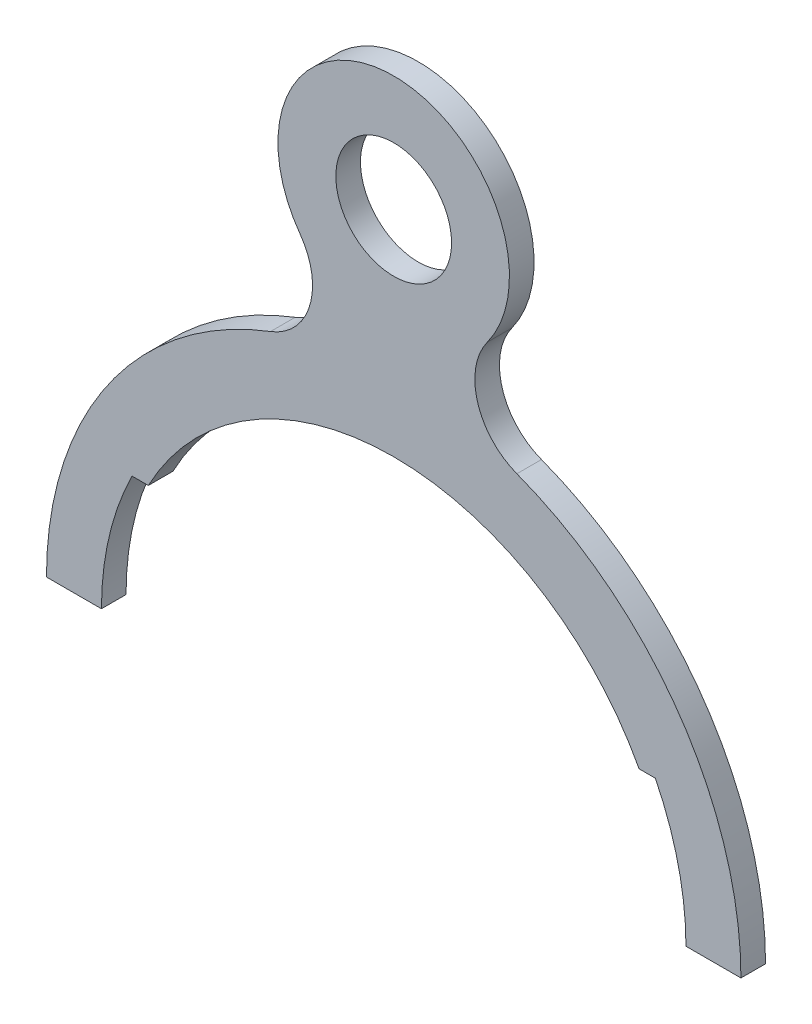
ISO-10303-21;
HEADER;
FILE_DESCRIPTION(('STEP AP214'),'2;1');
FILE_NAME('part.step','',(''),(''),'','','');
FILE_SCHEMA(('AUTOMOTIVE_DESIGN { 1 0 10303 214 1 1 1 1 }'));
ENDSEC;
DATA;
#1=APPLICATION_CONTEXT('core data for automotive mechanical design processes');
#2=APPLICATION_PROTOCOL_DEFINITION('international standard','automotive_design',2000,#1);
#3=PRODUCT_CONTEXT('',#1,'mechanical');
#4=PRODUCT('Part','Part','',(#3));
#5=PRODUCT_RELATED_PRODUCT_CATEGORY('part','',(#4));
#6=PRODUCT_DEFINITION_FORMATION('','',#4);
#7=PRODUCT_DEFINITION_CONTEXT('part definition',#1,'design');
#8=PRODUCT_DEFINITION('design','',#6,#7);
#9=PRODUCT_DEFINITION_SHAPE('','',#8);
#10=(LENGTH_UNIT() NAMED_UNIT(*) SI_UNIT(.MILLI.,.METRE.));
#11=(NAMED_UNIT(*) PLANE_ANGLE_UNIT() SI_UNIT($,.RADIAN.));
#12=(NAMED_UNIT(*) SI_UNIT($,.STERADIAN.) SOLID_ANGLE_UNIT());
#13=UNCERTAINTY_MEASURE_WITH_UNIT(LENGTH_MEASURE(1.E-05),#10,'distance_accuracy_value','');
#14=(GEOMETRIC_REPRESENTATION_CONTEXT(3) GLOBAL_UNCERTAINTY_ASSIGNED_CONTEXT((#13)) GLOBAL_UNIT_ASSIGNED_CONTEXT((#10,
#11,#12)) REPRESENTATION_CONTEXT('',''));
#15=CARTESIAN_POINT('',(0.,0.,0.));
#16=DIRECTION('',(0.,0.,1.));
#17=DIRECTION('',(1.,0.,0.));
#18=AXIS2_PLACEMENT_3D('',#15,#16,#17);
#19=CARTESIAN_POINT('',(140.,169.705627484771,8.5));
#20=DIRECTION('',(0.,0.,-1.));
#21=DIRECTION('',(-1.,0.,0.));
#22=AXIS2_PLACEMENT_3D('',#19,#20,#21);
#23=PLANE('',#22);
#24=CARTESIAN_POINT('',(0.,170.,8.5));
#25=DIRECTION('',(0.,0.,1.));
#26=DIRECTION('',(1.,0.,0.));
#27=AXIS2_PLACEMENT_3D('',#24,#25,#26);
#28=CIRCLE('',#27,20.);
#29=CARTESIAN_POINT('',(20.,170.,8.5));
#30=VERTEX_POINT('',#29);
#31=EDGE_CURVE('E143',#30,#30,#28,.T.);
#32=ORIENTED_EDGE('',*,*,#31,.F.);
#33=EDGE_LOOP('',(#32));
#34=FACE_BOUND('',#33,.T.);
#35=CARTESIAN_POINT('',(50.5431142826012,133.235294117647,8.5));
#36=DIRECTION('',(0.,0.,-1.));
#37=DIRECTION('',(-1.,0.,0.));
#38=AXIS2_PLACEMENT_3D('',#35,#36,#37);
#39=CIRCLE('',#38,22.5);
#40=CARTESIAN_POINT('',(42.5626225537694,112.198142414861,8.5));
#41=VERTEX_POINT('',#40);
#42=CARTESIAN_POINT('',(32.3475931408648,146.470588235294,8.5));
#43=VERTEX_POINT('',#42);
#44=EDGE_CURVE('E254',#41,#43,#39,.T.);
#45=ORIENTED_EDGE('',*,*,#44,.T.);
#46=CARTESIAN_POINT('',(0.,170.,8.5));
#47=DIRECTION('',(0.,0.,1.));
#48=DIRECTION('',(1.,0.,0.));
#49=AXIS2_PLACEMENT_3D('',#46,#47,#48);
#50=CIRCLE('',#49,40.);
#51=CARTESIAN_POINT('',(-32.3475931408648,146.470588235294,8.5));
#52=VERTEX_POINT('',#51);
#53=EDGE_CURVE('E159',#43,#52,#50,.T.);
#54=ORIENTED_EDGE('',*,*,#53,.T.);
#55=CARTESIAN_POINT('',(-50.5431142826012,133.235294117647,8.5));
#56=DIRECTION('',(0.,0.,1.));
#57=DIRECTION('',(1.,0.,0.));
#58=AXIS2_PLACEMENT_3D('',#55,#56,#57);
#59=CIRCLE('',#58,22.5);
#60=CARTESIAN_POINT('',(-42.5626225537694,112.198142414861,8.5));
#61=VERTEX_POINT('',#60);
#62=EDGE_CURVE('E199',#61,#52,#59,.T.);
#63=ORIENTED_EDGE('',*,*,#62,.F.);
#64=CARTESIAN_POINT('',(0.,0.,8.5));
#65=DIRECTION('',(0.,0.,1.));
#66=DIRECTION('',(1.,0.,0.));
#67=AXIS2_PLACEMENT_3D('',#64,#65,#66);
#68=CIRCLE('',#67,120.);
#69=CARTESIAN_POINT('',(-120.,0.,8.5));
#70=VERTEX_POINT('',#69);
#71=EDGE_CURVE('E97',#61,#70,#68,.T.);
#72=ORIENTED_EDGE('',*,*,#71,.T.);
#73=DIRECTION('',(1.,0.,0.));
#74=VECTOR('',#73,1.);
#75=CARTESIAN_POINT('',(-120.,0.,8.5));
#76=LINE('',#75,#74);
#77=CARTESIAN_POINT('',(-101.,0.,8.5));
#78=VERTEX_POINT('',#77);
#79=EDGE_CURVE('E220',#70,#78,#76,.T.);
#80=ORIENTED_EDGE('',*,*,#79,.T.);
#81=CARTESIAN_POINT('',(0.,0.,8.5));
#82=DIRECTION('',(0.,0.,-1.));
#83=DIRECTION('',(1.,0.,0.));
#84=AXIS2_PLACEMENT_3D('',#81,#82,#83);
#85=CIRCLE('',#84,101.);
#86=CARTESIAN_POINT('',(-90.4212364436585,45.,8.5));
#87=VERTEX_POINT('',#86);
#88=EDGE_CURVE('E222',#78,#87,#85,.T.);
#89=ORIENTED_EDGE('',*,*,#88,.T.);
#90=DIRECTION('',(1.,0.,0.));
#91=VECTOR('',#90,1.);
#92=CARTESIAN_POINT('',(-90.4212364436585,45.,8.5));
#93=LINE('',#92,#91);
#94=CARTESIAN_POINT('',(-84.7997641506154,45.,8.5));
#95=VERTEX_POINT('',#94);
#96=EDGE_CURVE('E224',#87,#95,#93,.T.);
#97=ORIENTED_EDGE('',*,*,#96,.T.);
#98=CARTESIAN_POINT('',(0.,0.,8.5));
#99=DIRECTION('',(0.,0.,-1.));
#100=DIRECTION('',(1.,0.,0.));
#101=AXIS2_PLACEMENT_3D('',#98,#99,#100);
#102=CIRCLE('',#101,96.);
#103=CARTESIAN_POINT('',(84.7997641506154,45.,8.5));
#104=VERTEX_POINT('',#103);
#105=EDGE_CURVE('E119',#95,#104,#102,.T.);
#106=ORIENTED_EDGE('',*,*,#105,.T.);
#107=DIRECTION('',(1.,0.,0.));
#108=VECTOR('',#107,1.);
#109=CARTESIAN_POINT('',(84.7997641506154,45.,8.5));
#110=LINE('',#109,#108);
#111=CARTESIAN_POINT('',(90.4212364436585,45.,8.5));
#112=VERTEX_POINT('',#111);
#113=EDGE_CURVE('E113',#104,#112,#110,.T.);
#114=ORIENTED_EDGE('',*,*,#113,.T.);
#115=CARTESIAN_POINT('',(0.,0.,8.5));
#116=DIRECTION('',(0.,0.,-1.));
#117=DIRECTION('',(1.,0.,0.));
#118=AXIS2_PLACEMENT_3D('',#115,#116,#117);
#119=CIRCLE('',#118,101.);
#120=CARTESIAN_POINT('',(101.,0.,8.5));
#121=VERTEX_POINT('',#120);
#122=EDGE_CURVE('E117',#112,#121,#119,.T.);
#123=ORIENTED_EDGE('',*,*,#122,.T.);
#124=DIRECTION('',(1.,0.,0.));
#125=VECTOR('',#124,1.);
#126=CARTESIAN_POINT('',(101.,0.,8.5));
#127=LINE('',#126,#125);
#128=CARTESIAN_POINT('',(120.,0.,8.5));
#129=VERTEX_POINT('',#128);
#130=EDGE_CURVE('E53',#121,#129,#127,.T.);
#131=ORIENTED_EDGE('',*,*,#130,.T.);
#132=CARTESIAN_POINT('',(0.,0.,8.5));
#133=DIRECTION('',(0.,0.,1.));
#134=DIRECTION('',(1.,0.,0.));
#135=AXIS2_PLACEMENT_3D('',#132,#133,#134);
#136=CIRCLE('',#135,120.);
#137=EDGE_CURVE('E133',#129,#41,#136,.T.);
#138=ORIENTED_EDGE('',*,*,#137,.T.);
#139=EDGE_LOOP('',(#45,#54,#63,#72,#80,#89,#97,#106,#114,#123,#131,#138));
#140=FACE_BOUND('',#139,.T.);
#141=ADVANCED_FACE('F36',(#34,#140),#23,.F.);
#142=CARTESIAN_POINT('',(140.,169.705627484771,0.));
#143=DIRECTION('',(0.,0.,-1.));
#144=DIRECTION('',(-1.,0.,0.));
#145=AXIS2_PLACEMENT_3D('',#142,#143,#144);
#146=PLANE('',#145);
#147=CARTESIAN_POINT('',(0.,170.,0.));
#148=DIRECTION('',(0.,0.,1.));
#149=DIRECTION('',(1.,0.,0.));
#150=AXIS2_PLACEMENT_3D('',#147,#148,#149);
#151=CIRCLE('',#150,20.);
#152=CARTESIAN_POINT('',(20.,170.,0.));
#153=VERTEX_POINT('',#152);
#154=EDGE_CURVE('E212',#153,#153,#151,.T.);
#155=ORIENTED_EDGE('',*,*,#154,.T.);
#156=EDGE_LOOP('',(#155));
#157=FACE_BOUND('',#156,.T.);
#158=CARTESIAN_POINT('',(0.,170.,0.));
#159=DIRECTION('',(0.,0.,1.));
#160=DIRECTION('',(1.,0.,0.));
#161=AXIS2_PLACEMENT_3D('',#158,#159,#160);
#162=CIRCLE('',#161,40.);
#163=CARTESIAN_POINT('',(32.3475931408648,146.470588235294,0.));
#164=VERTEX_POINT('',#163);
#165=CARTESIAN_POINT('',(-32.3475931408648,146.470588235294,0.));
#166=VERTEX_POINT('',#165);
#167=EDGE_CURVE('E139',#164,#166,#162,.T.);
#168=ORIENTED_EDGE('',*,*,#167,.F.);
#169=CARTESIAN_POINT('',(50.5431142826012,133.235294117647,0.));
#170=DIRECTION('',(0.,0.,-1.));
#171=DIRECTION('',(-1.,0.,0.));
#172=AXIS2_PLACEMENT_3D('',#169,#170,#171);
#173=CIRCLE('',#172,22.5);
#174=CARTESIAN_POINT('',(42.5626225537694,112.198142414861,0.));
#175=VERTEX_POINT('',#174);
#176=EDGE_CURVE('E11',#164,#175,#173,.F.);
#177=ORIENTED_EDGE('',*,*,#176,.T.);
#178=CARTESIAN_POINT('',(0.,0.,0.));
#179=DIRECTION('',(0.,0.,1.));
#180=DIRECTION('',(1.,0.,0.));
#181=AXIS2_PLACEMENT_3D('',#178,#179,#180);
#182=CIRCLE('',#181,120.);
#183=CARTESIAN_POINT('',(120.,0.,0.));
#184=VERTEX_POINT('',#183);
#185=EDGE_CURVE('E156',#184,#175,#182,.T.);
#186=ORIENTED_EDGE('',*,*,#185,.F.);
#187=DIRECTION('',(1.,0.,0.));
#188=VECTOR('',#187,1.);
#189=CARTESIAN_POINT('',(101.,0.,0.));
#190=LINE('',#189,#188);
#191=CARTESIAN_POINT('',(101.,0.,0.));
#192=VERTEX_POINT('',#191);
#193=EDGE_CURVE('E89',#192,#184,#190,.T.);
#194=ORIENTED_EDGE('',*,*,#193,.F.);
#195=CARTESIAN_POINT('',(0.,0.,0.));
#196=DIRECTION('',(0.,0.,-1.));
#197=DIRECTION('',(1.,0.,0.));
#198=AXIS2_PLACEMENT_3D('',#195,#196,#197);
#199=CIRCLE('',#198,101.);
#200=CARTESIAN_POINT('',(90.4212364436585,45.,0.));
#201=VERTEX_POINT('',#200);
#202=EDGE_CURVE('E83',#201,#192,#199,.T.);
#203=ORIENTED_EDGE('',*,*,#202,.F.);
#204=DIRECTION('',(1.,0.,0.));
#205=VECTOR('',#204,1.);
#206=CARTESIAN_POINT('',(84.7997641506154,45.,0.));
#207=LINE('',#206,#205);
#208=CARTESIAN_POINT('',(84.7997641506154,45.,0.));
#209=VERTEX_POINT('',#208);
#210=EDGE_CURVE('E127',#209,#201,#207,.T.);
#211=ORIENTED_EDGE('',*,*,#210,.F.);
#212=CARTESIAN_POINT('',(0.,0.,0.));
#213=DIRECTION('',(0.,0.,-1.));
#214=DIRECTION('',(1.,0.,0.));
#215=AXIS2_PLACEMENT_3D('',#212,#213,#214);
#216=CIRCLE('',#215,96.);
#217=CARTESIAN_POINT('',(-84.7997641506154,45.,0.));
#218=VERTEX_POINT('',#217);
#219=EDGE_CURVE('E151',#218,#209,#216,.T.);
#220=ORIENTED_EDGE('',*,*,#219,.F.);
#221=DIRECTION('',(1.,0.,0.));
#222=VECTOR('',#221,1.);
#223=CARTESIAN_POINT('',(-90.4212364436585,45.,0.));
#224=LINE('',#223,#222);
#225=CARTESIAN_POINT('',(-90.4212364436585,45.,0.));
#226=VERTEX_POINT('',#225);
#227=EDGE_CURVE('E149',#226,#218,#224,.T.);
#228=ORIENTED_EDGE('',*,*,#227,.F.);
#229=CARTESIAN_POINT('',(0.,0.,0.));
#230=DIRECTION('',(0.,0.,-1.));
#231=DIRECTION('',(1.,0.,0.));
#232=AXIS2_PLACEMENT_3D('',#229,#230,#231);
#233=CIRCLE('',#232,101.);
#234=CARTESIAN_POINT('',(-101.,0.,0.));
#235=VERTEX_POINT('',#234);
#236=EDGE_CURVE('E147',#235,#226,#233,.T.);
#237=ORIENTED_EDGE('',*,*,#236,.F.);
#238=DIRECTION('',(1.,0.,0.));
#239=VECTOR('',#238,1.);
#240=CARTESIAN_POINT('',(-120.,0.,0.));
#241=LINE('',#240,#239);
#242=CARTESIAN_POINT('',(-120.,0.,0.));
#243=VERTEX_POINT('',#242);
#244=EDGE_CURVE('E145',#243,#235,#241,.T.);
#245=ORIENTED_EDGE('',*,*,#244,.F.);
#246=CARTESIAN_POINT('',(0.,0.,0.));
#247=DIRECTION('',(0.,0.,1.));
#248=DIRECTION('',(1.,0.,0.));
#249=AXIS2_PLACEMENT_3D('',#246,#247,#248);
#250=CIRCLE('',#249,120.);
#251=CARTESIAN_POINT('',(-42.5626225537694,112.198142414861,0.));
#252=VERTEX_POINT('',#251);
#253=EDGE_CURVE('E142',#252,#243,#250,.T.);
#254=ORIENTED_EDGE('',*,*,#253,.F.);
#255=CARTESIAN_POINT('',(-50.5431142826012,133.235294117647,0.));
#256=DIRECTION('',(0.,0.,-1.));
#257=DIRECTION('',(-1.,0.,0.));
#258=AXIS2_PLACEMENT_3D('',#255,#256,#257);
#259=CIRCLE('',#258,22.5);
#260=EDGE_CURVE('E45',#166,#252,#259,.T.);
#261=ORIENTED_EDGE('',*,*,#260,.F.);
#262=EDGE_LOOP('',(#168,#177,#186,#194,#203,#211,#220,#228,#237,#245,#254,#261));
#263=FACE_BOUND('',#262,.T.);
#264=ADVANCED_FACE('F235',(#157,#263),#146,.T.);
#265=CARTESIAN_POINT('',(0.,170.,8.5));
#266=DIRECTION('',(0.,0.,-1.));
#267=DIRECTION('',(-1.,0.,0.));
#268=AXIS2_PLACEMENT_3D('',#265,#266,#267);
#269=CYLINDRICAL_SURFACE('',#268,40.);
#270=ORIENTED_EDGE('',*,*,#167,.T.);
#271=DIRECTION('',(0.,0.,1.));
#272=VECTOR('',#271,1.);
#273=CARTESIAN_POINT('',(-32.3475931408648,146.470588235294,-1.5));
#274=LINE('',#273,#272);
#275=EDGE_CURVE('E187',#166,#52,#274,.T.);
#276=ORIENTED_EDGE('',*,*,#275,.T.);
#277=ORIENTED_EDGE('',*,*,#53,.F.);
#278=DIRECTION('',(0.,0.,1.));
#279=VECTOR('',#278,1.);
#280=CARTESIAN_POINT('',(32.3475931408648,146.470588235294,-1.5));
#281=LINE('',#280,#279);
#282=EDGE_CURVE('E255',#164,#43,#281,.T.);
#283=ORIENTED_EDGE('',*,*,#282,.F.);
#284=EDGE_LOOP('',(#270,#276,#277,#283));
#285=FACE_BOUND('',#284,.T.);
#286=ADVANCED_FACE('F38',(#285),#269,.T.);
#287=CARTESIAN_POINT('',(0.,0.,8.5));
#288=DIRECTION('',(0.,0.,-1.));
#289=DIRECTION('',(-1.,0.,0.));
#290=AXIS2_PLACEMENT_3D('',#287,#288,#289);
#291=CYLINDRICAL_SURFACE('',#290,120.);
#292=ORIENTED_EDGE('',*,*,#253,.T.);
#293=DIRECTION('',(0.,0.,-1.));
#294=VECTOR('',#293,1.);
#295=CARTESIAN_POINT('',(-120.,0.,8.5));
#296=LINE('',#295,#294);
#297=EDGE_CURVE('E172',#70,#243,#296,.T.);
#298=ORIENTED_EDGE('',*,*,#297,.F.);
#299=ORIENTED_EDGE('',*,*,#71,.F.);
#300=DIRECTION('',(0.,0.,1.));
#301=VECTOR('',#300,1.);
#302=CARTESIAN_POINT('',(-42.5626225537694,112.198142414861,-1.5));
#303=LINE('',#302,#301);
#304=EDGE_CURVE('E184',#252,#61,#303,.T.);
#305=ORIENTED_EDGE('',*,*,#304,.F.);
#306=EDGE_LOOP('',(#292,#298,#299,#305));
#307=FACE_BOUND('',#306,.T.);
#308=ADVANCED_FACE('F193',(#307),#291,.T.);
#309=CARTESIAN_POINT('',(-120.,0.,8.5));
#310=DIRECTION('',(0.,1.,0.));
#311=DIRECTION('',(0.,0.,1.));
#312=AXIS2_PLACEMENT_3D('',#309,#310,#311);
#313=PLANE('',#312);
#314=CARTESIAN_POINT('',(-115.,0.,4.25));
#315=DIRECTION('',(0.,-1.,0.));
#316=DIRECTION('',(0.,0.,-1.));
#317=AXIS2_PLACEMENT_3D('',#314,#315,#316);
#318=CIRCLE('',#317,1.65);
#319=CARTESIAN_POINT('',(-115.,0.,2.6));
#320=VERTEX_POINT('',#319);
#321=EDGE_CURVE('E194',#320,#320,#318,.T.);
#322=ORIENTED_EDGE('',*,*,#321,.F.);
#323=EDGE_LOOP('',(#322));
#324=FACE_BOUND('',#323,.T.);
#325=ORIENTED_EDGE('',*,*,#244,.T.);
#326=DIRECTION('',(0.,0.,-1.));
#327=VECTOR('',#326,1.);
#328=CARTESIAN_POINT('',(-101.,0.,8.5));
#329=LINE('',#328,#327);
#330=EDGE_CURVE('E169',#78,#235,#329,.T.);
#331=ORIENTED_EDGE('',*,*,#330,.F.);
#332=ORIENTED_EDGE('',*,*,#79,.F.);
#333=ORIENTED_EDGE('',*,*,#297,.T.);
#334=EDGE_LOOP('',(#325,#331,#332,#333));
#335=FACE_BOUND('',#334,.T.);
#336=ADVANCED_FACE('F382',(#324,#335),#313,.F.);
#337=CARTESIAN_POINT('',(0.,0.,8.5));
#338=DIRECTION('',(0.,0.,-1.));
#339=DIRECTION('',(-1.,0.,0.));
#340=AXIS2_PLACEMENT_3D('',#337,#338,#339);
#341=CYLINDRICAL_SURFACE('',#340,101.);
#342=ORIENTED_EDGE('',*,*,#236,.T.);
#343=DIRECTION('',(0.,0.,-1.));
#344=VECTOR('',#343,1.);
#345=CARTESIAN_POINT('',(-90.4212364436585,45.,8.5));
#346=LINE('',#345,#344);
#347=EDGE_CURVE('E166',#87,#226,#346,.T.);
#348=ORIENTED_EDGE('',*,*,#347,.F.);
#349=ORIENTED_EDGE('',*,*,#88,.F.);
#350=ORIENTED_EDGE('',*,*,#330,.T.);
#351=EDGE_LOOP('',(#342,#348,#349,#350));
#352=FACE_BOUND('',#351,.T.);
#353=ADVANCED_FACE('F436',(#352),#341,.F.);
#354=CARTESIAN_POINT('',(-90.4212364436585,45.,8.5));
#355=DIRECTION('',(0.,1.,0.));
#356=DIRECTION('',(0.,0.,1.));
#357=AXIS2_PLACEMENT_3D('',#354,#355,#356);
#358=PLANE('',#357);
#359=ORIENTED_EDGE('',*,*,#227,.T.);
#360=DIRECTION('',(0.,0.,-1.));
#361=VECTOR('',#360,1.);
#362=CARTESIAN_POINT('',(-84.7997641506154,45.,8.5));
#363=LINE('',#362,#361);
#364=EDGE_CURVE('E163',#95,#218,#363,.T.);
#365=ORIENTED_EDGE('',*,*,#364,.F.);
#366=ORIENTED_EDGE('',*,*,#96,.F.);
#367=ORIENTED_EDGE('',*,*,#347,.T.);
#368=EDGE_LOOP('',(#359,#365,#366,#367));
#369=FACE_BOUND('',#368,.T.);
#370=ADVANCED_FACE('F230',(#369),#358,.F.);
#371=CARTESIAN_POINT('',(0.,0.,8.5));
#372=DIRECTION('',(0.,0.,-1.));
#373=DIRECTION('',(-1.,0.,0.));
#374=AXIS2_PLACEMENT_3D('',#371,#372,#373);
#375=CYLINDRICAL_SURFACE('',#374,96.);
#376=ORIENTED_EDGE('',*,*,#219,.T.);
#377=DIRECTION('',(0.,0.,-1.));
#378=VECTOR('',#377,1.);
#379=CARTESIAN_POINT('',(84.7997641506154,45.,8.5));
#380=LINE('',#379,#378);
#381=EDGE_CURVE('E128',#104,#209,#380,.T.);
#382=ORIENTED_EDGE('',*,*,#381,.F.);
#383=ORIENTED_EDGE('',*,*,#105,.F.);
#384=ORIENTED_EDGE('',*,*,#364,.T.);
#385=EDGE_LOOP('',(#376,#382,#383,#384));
#386=FACE_BOUND('',#385,.T.);
#387=ADVANCED_FACE('F234',(#386),#375,.F.);
#388=CARTESIAN_POINT('',(84.7997641506154,45.,8.5));
#389=DIRECTION('',(0.,1.,0.));
#390=DIRECTION('',(0.,0.,1.));
#391=AXIS2_PLACEMENT_3D('',#388,#389,#390);
#392=PLANE('',#391);
#393=ORIENTED_EDGE('',*,*,#210,.T.);
#394=DIRECTION('',(0.,0.,-1.));
#395=VECTOR('',#394,1.);
#396=CARTESIAN_POINT('',(90.4212364436585,45.,8.5));
#397=LINE('',#396,#395);
#398=EDGE_CURVE('E124',#112,#201,#397,.T.);
#399=ORIENTED_EDGE('',*,*,#398,.F.);
#400=ORIENTED_EDGE('',*,*,#113,.F.);
#401=ORIENTED_EDGE('',*,*,#381,.T.);
#402=EDGE_LOOP('',(#393,#399,#400,#401));
#403=FACE_BOUND('',#402,.T.);
#404=ADVANCED_FACE('F125',(#403),#392,.F.);
#405=CARTESIAN_POINT('',(0.,0.,8.5));
#406=DIRECTION('',(0.,0.,-1.));
#407=DIRECTION('',(-1.,0.,0.));
#408=AXIS2_PLACEMENT_3D('',#405,#406,#407);
#409=CYLINDRICAL_SURFACE('',#408,101.);
#410=ORIENTED_EDGE('',*,*,#202,.T.);
#411=DIRECTION('',(0.,0.,-1.));
#412=VECTOR('',#411,1.);
#413=CARTESIAN_POINT('',(101.,0.,8.5));
#414=LINE('',#413,#412);
#415=EDGE_CURVE('E129',#121,#192,#414,.T.);
#416=ORIENTED_EDGE('',*,*,#415,.F.);
#417=ORIENTED_EDGE('',*,*,#122,.F.);
#418=ORIENTED_EDGE('',*,*,#398,.T.);
#419=EDGE_LOOP('',(#410,#416,#417,#418));
#420=FACE_BOUND('',#419,.T.);
#421=ADVANCED_FACE('F131',(#420),#409,.F.);
#422=CARTESIAN_POINT('',(101.,0.,8.5));
#423=DIRECTION('',(0.,1.,0.));
#424=DIRECTION('',(0.,0.,1.));
#425=AXIS2_PLACEMENT_3D('',#422,#423,#424);
#426=PLANE('',#425);
#427=CARTESIAN_POINT('',(115.,0.,4.25));
#428=DIRECTION('',(0.,-1.,0.));
#429=DIRECTION('',(0.,0.,-1.));
#430=AXIS2_PLACEMENT_3D('',#427,#428,#429);
#431=CIRCLE('',#430,1.65);
#432=CARTESIAN_POINT('',(115.,0.,2.6));
#433=VERTEX_POINT('',#432);
#434=EDGE_CURVE('E206',#433,#433,#431,.T.);
#435=ORIENTED_EDGE('',*,*,#434,.F.);
#436=EDGE_LOOP('',(#435));
#437=FACE_BOUND('',#436,.T.);
#438=ORIENTED_EDGE('',*,*,#193,.T.);
#439=DIRECTION('',(0.,0.,-1.));
#440=VECTOR('',#439,1.);
#441=CARTESIAN_POINT('',(120.,0.,8.5));
#442=LINE('',#441,#440);
#443=EDGE_CURVE('E138',#129,#184,#442,.T.);
#444=ORIENTED_EDGE('',*,*,#443,.F.);
#445=ORIENTED_EDGE('',*,*,#130,.F.);
#446=ORIENTED_EDGE('',*,*,#415,.T.);
#447=EDGE_LOOP('',(#438,#444,#445,#446));
#448=FACE_BOUND('',#447,.T.);
#449=ADVANCED_FACE('F286',(#437,#448),#426,.F.);
#450=CARTESIAN_POINT('',(0.,0.,8.5));
#451=DIRECTION('',(0.,0.,-1.));
#452=DIRECTION('',(-1.,0.,0.));
#453=AXIS2_PLACEMENT_3D('',#450,#451,#452);
#454=CYLINDRICAL_SURFACE('',#453,120.);
#455=ORIENTED_EDGE('',*,*,#185,.T.);
#456=DIRECTION('',(0.,0.,1.));
#457=VECTOR('',#456,1.);
#458=CARTESIAN_POINT('',(42.5626225537694,112.198142414861,-1.5));
#459=LINE('',#458,#457);
#460=EDGE_CURVE('E245',#175,#41,#459,.T.);
#461=ORIENTED_EDGE('',*,*,#460,.T.);
#462=ORIENTED_EDGE('',*,*,#137,.F.);
#463=ORIENTED_EDGE('',*,*,#443,.T.);
#464=EDGE_LOOP('',(#455,#461,#462,#463));
#465=FACE_BOUND('',#464,.T.);
#466=ADVANCED_FACE('F242',(#465),#454,.T.);
#467=CARTESIAN_POINT('',(0.,170.,8.5));
#468=DIRECTION('',(0.,0.,-1.));
#469=DIRECTION('',(-1.,0.,0.));
#470=AXIS2_PLACEMENT_3D('',#467,#468,#469);
#471=CYLINDRICAL_SURFACE('',#470,20.);
#472=ORIENTED_EDGE('',*,*,#31,.T.);
#473=EDGE_LOOP('',(#472));
#474=FACE_BOUND('',#473,.T.);
#475=ORIENTED_EDGE('',*,*,#154,.F.);
#476=EDGE_LOOP('',(#475));
#477=FACE_BOUND('',#476,.T.);
#478=ADVANCED_FACE('F276',(#474,#477),#471,.F.);
#479=CARTESIAN_POINT('',(115.,10.1,4.25));
#480=DIRECTION('',(0.,-1.,0.));
#481=DIRECTION('',(0.,0.,-1.));
#482=AXIS2_PLACEMENT_3D('',#479,#480,#481);
#483=CONICAL_SURFACE('',#482,1.65,1.02974425867665);
#484=CARTESIAN_POINT('',(115.,11.0914200213955,4.25));
#485=VERTEX_POINT('',#484);
#486=VERTEX_LOOP('',#485);
#487=FACE_BOUND('',#486,.T.);
#488=CARTESIAN_POINT('',(115.,10.1,4.25));
#489=DIRECTION('',(0.,-1.,0.));
#490=DIRECTION('',(0.,0.,-1.));
#491=AXIS2_PLACEMENT_3D('',#488,#489,#490);
#492=CIRCLE('',#491,1.65);
#493=CARTESIAN_POINT('',(115.,10.1,2.6));
#494=VERTEX_POINT('',#493);
#495=EDGE_CURVE('E209',#494,#494,#492,.T.);
#496=ORIENTED_EDGE('',*,*,#495,.T.);
#497=EDGE_LOOP('',(#496));
#498=FACE_BOUND('',#497,.T.);
#499=ADVANCED_FACE('F272',(#487,#498),#483,.F.);
#500=CARTESIAN_POINT('',(115.,0.,4.25));
#501=DIRECTION('',(0.,-1.,0.));
#502=DIRECTION('',(0.,0.,-1.));
#503=AXIS2_PLACEMENT_3D('',#500,#501,#502);
#504=CYLINDRICAL_SURFACE('',#503,1.65);
#505=ORIENTED_EDGE('',*,*,#495,.F.);
#506=EDGE_LOOP('',(#505));
#507=FACE_BOUND('',#506,.T.);
#508=ORIENTED_EDGE('',*,*,#434,.T.);
#509=EDGE_LOOP('',(#508));
#510=FACE_BOUND('',#509,.T.);
#511=ADVANCED_FACE('F275',(#507,#510),#504,.F.);
#512=CARTESIAN_POINT('',(-115.,10.1,4.25));
#513=DIRECTION('',(0.,-1.,0.));
#514=DIRECTION('',(0.,0.,-1.));
#515=AXIS2_PLACEMENT_3D('',#512,#513,#514);
#516=CONICAL_SURFACE('',#515,1.65,1.02974425867665);
#517=CARTESIAN_POINT('',(-115.,11.0914200213955,4.25));
#518=VERTEX_POINT('',#517);
#519=VERTEX_LOOP('',#518);
#520=FACE_BOUND('',#519,.T.);
#521=CARTESIAN_POINT('',(-115.,10.1,4.25));
#522=DIRECTION('',(0.,-1.,0.));
#523=DIRECTION('',(0.,0.,-1.));
#524=AXIS2_PLACEMENT_3D('',#521,#522,#523);
#525=CIRCLE('',#524,1.65);
#526=CARTESIAN_POINT('',(-115.,10.1,2.6));
#527=VERTEX_POINT('',#526);
#528=EDGE_CURVE('E197',#527,#527,#525,.T.);
#529=ORIENTED_EDGE('',*,*,#528,.T.);
#530=EDGE_LOOP('',(#529));
#531=FACE_BOUND('',#530,.T.);
#532=ADVANCED_FACE('F282',(#520,#531),#516,.F.);
#533=CARTESIAN_POINT('',(-115.,0.,4.25));
#534=DIRECTION('',(0.,-1.,0.));
#535=DIRECTION('',(0.,0.,-1.));
#536=AXIS2_PLACEMENT_3D('',#533,#534,#535);
#537=CYLINDRICAL_SURFACE('',#536,1.65);
#538=ORIENTED_EDGE('',*,*,#528,.F.);
#539=EDGE_LOOP('',(#538));
#540=FACE_BOUND('',#539,.T.);
#541=ORIENTED_EDGE('',*,*,#321,.T.);
#542=EDGE_LOOP('',(#541));
#543=FACE_BOUND('',#542,.T.);
#544=ADVANCED_FACE('F310',(#540,#543),#537,.F.);
#545=CARTESIAN_POINT('',(-50.5431142826012,133.235294117647,-1.5));
#546=DIRECTION('',(0.,0.,1.));
#547=DIRECTION('',(1.,0.,0.));
#548=AXIS2_PLACEMENT_3D('',#545,#546,#547);
#549=CYLINDRICAL_SURFACE('',#548,22.5);
#550=ORIENTED_EDGE('',*,*,#260,.T.);
#551=ORIENTED_EDGE('',*,*,#304,.T.);
#552=ORIENTED_EDGE('',*,*,#62,.T.);
#553=ORIENTED_EDGE('',*,*,#275,.F.);
#554=EDGE_LOOP('',(#550,#551,#552,#553));
#555=FACE_BOUND('',#554,.T.);
#556=ADVANCED_FACE('F181',(#555),#549,.F.);
#557=CARTESIAN_POINT('',(50.5431142826012,133.235294117647,-1.5));
#558=DIRECTION('',(0.,0.,1.));
#559=DIRECTION('',(1.,0.,0.));
#560=AXIS2_PLACEMENT_3D('',#557,#558,#559);
#561=CYLINDRICAL_SURFACE('',#560,22.5);
#562=ORIENTED_EDGE('',*,*,#282,.T.);
#563=ORIENTED_EDGE('',*,*,#44,.F.);
#564=ORIENTED_EDGE('',*,*,#460,.F.);
#565=ORIENTED_EDGE('',*,*,#176,.F.);
#566=EDGE_LOOP('',(#562,#563,#564,#565));
#567=FACE_BOUND('',#566,.T.);
#568=ADVANCED_FACE('F252',(#567),#561,.F.);
#569=CLOSED_SHELL('',(#141,#264,#286,#308,#336,#353,#370,#387,#404,#421,#449,#466,#478,#499,
#511,#532,#544,#556,#568));
#570=MANIFOLD_SOLID_BREP('B2',#569);
#571=ADVANCED_BREP_SHAPE_REPRESENTATION('',(#18,#570),#14);
#572=SHAPE_DEFINITION_REPRESENTATION(#9,#571);
ENDSEC;
END-ISO-10303-21;
